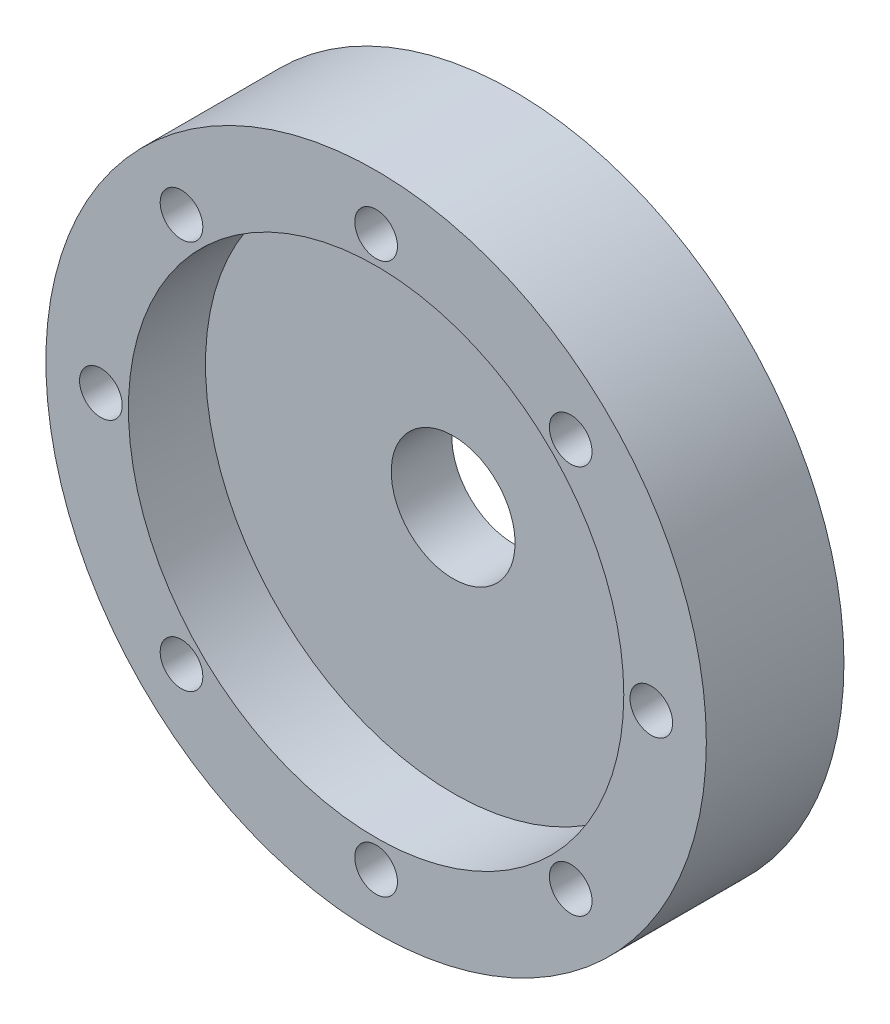
ISO-10303-21;
HEADER;
FILE_DESCRIPTION(('STEP AP214'),'2;1');
FILE_NAME('part.step','',(''),(''),'','','');
FILE_SCHEMA(('AUTOMOTIVE_DESIGN { 1 0 10303 214 1 1 1 1 }'));
ENDSEC;
DATA;
#1=APPLICATION_CONTEXT('core data for automotive mechanical design processes');
#2=APPLICATION_PROTOCOL_DEFINITION('international standard','automotive_design',2000,#1);
#3=PRODUCT_CONTEXT('',#1,'mechanical');
#4=PRODUCT('Part','Part','',(#3));
#5=PRODUCT_RELATED_PRODUCT_CATEGORY('part','',(#4));
#6=PRODUCT_DEFINITION_FORMATION('','',#4);
#7=PRODUCT_DEFINITION_CONTEXT('part definition',#1,'design');
#8=PRODUCT_DEFINITION('design','',#6,#7);
#9=PRODUCT_DEFINITION_SHAPE('','',#8);
#10=(LENGTH_UNIT() NAMED_UNIT(*) SI_UNIT(.MILLI.,.METRE.));
#11=(NAMED_UNIT(*) PLANE_ANGLE_UNIT() SI_UNIT($,.RADIAN.));
#12=(NAMED_UNIT(*) SI_UNIT($,.STERADIAN.) SOLID_ANGLE_UNIT());
#13=UNCERTAINTY_MEASURE_WITH_UNIT(LENGTH_MEASURE(1.E-05),#10,'distance_accuracy_value','');
#14=(GEOMETRIC_REPRESENTATION_CONTEXT(3) GLOBAL_UNCERTAINTY_ASSIGNED_CONTEXT((#13)) GLOBAL_UNIT_ASSIGNED_CONTEXT((#10,
#11,#12)) REPRESENTATION_CONTEXT('',''));
#15=CARTESIAN_POINT('',(0.,0.,0.));
#16=DIRECTION('',(0.,0.,1.));
#17=DIRECTION('',(1.,0.,0.));
#18=AXIS2_PLACEMENT_3D('',#15,#16,#17);
#19=CARTESIAN_POINT('',(0.,0.,10.));
#20=DIRECTION('',(0.,0.,-1.));
#21=DIRECTION('',(-1.,0.,0.));
#22=AXIS2_PLACEMENT_3D('',#19,#20,#21);
#23=CYLINDRICAL_SURFACE('',#22,4.5);
#24=CARTESIAN_POINT('',(0.,0.,0.));
#25=DIRECTION('',(0.,0.,1.));
#26=DIRECTION('',(1.,0.,0.));
#27=AXIS2_PLACEMENT_3D('',#24,#25,#26);
#28=CIRCLE('',#27,4.5);
#29=CARTESIAN_POINT('',(4.5,0.,0.));
#30=VERTEX_POINT('',#29);
#31=EDGE_CURVE('E123',#30,#30,#28,.T.);
#32=ORIENTED_EDGE('',*,*,#31,.F.);
#33=EDGE_LOOP('',(#32));
#34=FACE_BOUND('',#33,.T.);
#35=CARTESIAN_POINT('',(0.,0.,4.4));
#36=DIRECTION('',(0.,0.,1.));
#37=DIRECTION('',(1.,0.,0.));
#38=AXIS2_PLACEMENT_3D('',#35,#36,#37);
#39=CIRCLE('',#38,4.5);
#40=CARTESIAN_POINT('',(4.5,0.,4.4));
#41=VERTEX_POINT('',#40);
#42=EDGE_CURVE('E41',#41,#41,#39,.T.);
#43=ORIENTED_EDGE('',*,*,#42,.T.);
#44=EDGE_LOOP('',(#43));
#45=FACE_BOUND('',#44,.T.);
#46=ADVANCED_FACE('F37',(#34,#45),#23,.F.);
#47=CARTESIAN_POINT('',(0.,20.,10.));
#48=DIRECTION('',(0.,0.,-1.));
#49=DIRECTION('',(-1.,0.,0.));
#50=AXIS2_PLACEMENT_3D('',#47,#48,#49);
#51=CYLINDRICAL_SURFACE('',#50,1.55);
#52=CARTESIAN_POINT('',(0.,20.,10.));
#53=DIRECTION('',(0.,0.,1.));
#54=DIRECTION('',(1.,0.,0.));
#55=AXIS2_PLACEMENT_3D('',#52,#53,#54);
#56=CIRCLE('',#55,1.55);
#57=CARTESIAN_POINT('',(1.55,20.,10.));
#58=VERTEX_POINT('',#57);
#59=EDGE_CURVE('E52',#58,#58,#56,.T.);
#60=ORIENTED_EDGE('',*,*,#59,.T.);
#61=EDGE_LOOP('',(#60));
#62=FACE_BOUND('',#61,.T.);
#63=CARTESIAN_POINT('',(0.,20.,3.));
#64=DIRECTION('',(0.,0.,-1.));
#65=DIRECTION('',(-1.,0.,0.));
#66=AXIS2_PLACEMENT_3D('',#63,#64,#65);
#67=CIRCLE('',#66,1.55);
#68=CARTESIAN_POINT('',(-1.55,20.,3.));
#69=VERTEX_POINT('',#68);
#70=EDGE_CURVE('E85',#69,#69,#67,.T.);
#71=ORIENTED_EDGE('',*,*,#70,.T.);
#72=EDGE_LOOP('',(#71));
#73=FACE_BOUND('',#72,.T.);
#74=ADVANCED_FACE('F132',(#62,#73),#51,.F.);
#75=CARTESIAN_POINT('',(14.1421356237312,14.1421356237316,10.));
#76=DIRECTION('',(0.,0.,-1.));
#77=DIRECTION('',(-1.,0.,0.));
#78=AXIS2_PLACEMENT_3D('',#75,#76,#77);
#79=CYLINDRICAL_SURFACE('',#78,1.5500000000001);
#80=CARTESIAN_POINT('',(14.1421356237312,14.1421356237316,10.));
#81=DIRECTION('',(0.,0.,1.));
#82=DIRECTION('',(1.,0.,0.));
#83=AXIS2_PLACEMENT_3D('',#80,#81,#82);
#84=CIRCLE('',#83,1.5500000000001);
#85=CARTESIAN_POINT('',(15.6921356237313,14.1421356237316,10.));
#86=VERTEX_POINT('',#85);
#87=EDGE_CURVE('E120',#86,#86,#84,.T.);
#88=ORIENTED_EDGE('',*,*,#87,.T.);
#89=EDGE_LOOP('',(#88));
#90=FACE_BOUND('',#89,.T.);
#91=CARTESIAN_POINT('',(14.1421356237312,14.1421356237316,3.));
#92=DIRECTION('',(0.,0.,-1.));
#93=DIRECTION('',(-1.,0.,0.));
#94=AXIS2_PLACEMENT_3D('',#91,#92,#93);
#95=CIRCLE('',#94,1.5500000000001);
#96=CARTESIAN_POINT('',(12.5921356237311,14.1421356237316,3.));
#97=VERTEX_POINT('',#96);
#98=EDGE_CURVE('E82',#97,#97,#95,.T.);
#99=ORIENTED_EDGE('',*,*,#98,.T.);
#100=EDGE_LOOP('',(#99));
#101=FACE_BOUND('',#100,.T.);
#102=ADVANCED_FACE('F266',(#90,#101),#79,.F.);
#103=CARTESIAN_POINT('',(20.0000000000008,8.50201989313825E-13,10.));
#104=DIRECTION('',(0.,0.,-1.));
#105=DIRECTION('',(-1.,0.,0.));
#106=AXIS2_PLACEMENT_3D('',#103,#104,#105);
#107=CYLINDRICAL_SURFACE('',#106,1.55000000000063);
#108=CARTESIAN_POINT('',(20.0000000000008,8.50201989313825E-13,10.));
#109=DIRECTION('',(0.,0.,1.));
#110=DIRECTION('',(1.,0.,0.));
#111=AXIS2_PLACEMENT_3D('',#108,#109,#110);
#112=CIRCLE('',#111,1.55000000000063);
#113=CARTESIAN_POINT('',(21.5500000000015,8.50201989313825E-13,10.));
#114=VERTEX_POINT('',#113);
#115=EDGE_CURVE('E116',#114,#114,#112,.T.);
#116=ORIENTED_EDGE('',*,*,#115,.T.);
#117=EDGE_LOOP('',(#116));
#118=FACE_BOUND('',#117,.T.);
#119=CARTESIAN_POINT('',(20.0000000000008,8.50201989313825E-13,3.));
#120=DIRECTION('',(0.,0.,-1.));
#121=DIRECTION('',(-1.,0.,0.));
#122=AXIS2_PLACEMENT_3D('',#119,#120,#121);
#123=CIRCLE('',#122,1.55000000000063);
#124=CARTESIAN_POINT('',(18.4500000000002,8.50201989313825E-13,3.));
#125=VERTEX_POINT('',#124);
#126=EDGE_CURVE('E78',#125,#125,#123,.T.);
#127=ORIENTED_EDGE('',*,*,#126,.T.);
#128=EDGE_LOOP('',(#127));
#129=FACE_BOUND('',#128,.T.);
#130=ADVANCED_FACE('F272',(#118,#129),#107,.F.);
#131=CARTESIAN_POINT('',(14.1421356237324,-14.1421356237303,10.));
#132=DIRECTION('',(0.,0.,-1.));
#133=DIRECTION('',(-1.,0.,0.));
#134=AXIS2_PLACEMENT_3D('',#131,#132,#133);
#135=CYLINDRICAL_SURFACE('',#134,1.55000000000131);
#136=CARTESIAN_POINT('',(14.1421356237324,-14.1421356237303,10.));
#137=DIRECTION('',(0.,0.,1.));
#138=DIRECTION('',(1.,0.,0.));
#139=AXIS2_PLACEMENT_3D('',#136,#137,#138);
#140=CIRCLE('',#139,1.55000000000131);
#141=CARTESIAN_POINT('',(15.6921356237337,-14.1421356237303,10.));
#142=VERTEX_POINT('',#141);
#143=EDGE_CURVE('E112',#142,#142,#140,.T.);
#144=ORIENTED_EDGE('',*,*,#143,.T.);
#145=EDGE_LOOP('',(#144));
#146=FACE_BOUND('',#145,.T.);
#147=CARTESIAN_POINT('',(14.1421356237324,-14.1421356237303,3.));
#148=DIRECTION('',(0.,0.,-1.));
#149=DIRECTION('',(-1.,0.,0.));
#150=AXIS2_PLACEMENT_3D('',#147,#148,#149);
#151=CIRCLE('',#150,1.55000000000131);
#152=CARTESIAN_POINT('',(12.5921356237311,-14.1421356237303,3.));
#153=VERTEX_POINT('',#152);
#154=EDGE_CURVE('E74',#153,#153,#151,.T.);
#155=ORIENTED_EDGE('',*,*,#154,.T.);
#156=EDGE_LOOP('',(#155));
#157=FACE_BOUND('',#156,.T.);
#158=ADVANCED_FACE('F276',(#146,#157),#135,.F.);
#159=CARTESIAN_POINT('',(1.70040397862765E-12,-20.,10.));
#160=DIRECTION('',(0.,0.,-1.));
#161=DIRECTION('',(-1.,0.,0.));
#162=AXIS2_PLACEMENT_3D('',#159,#160,#161);
#163=CYLINDRICAL_SURFACE('',#162,1.55000000000176);
#164=CARTESIAN_POINT('',(1.70040397862765E-12,-20.,10.));
#165=DIRECTION('',(0.,0.,1.));
#166=DIRECTION('',(1.,0.,0.));
#167=AXIS2_PLACEMENT_3D('',#164,#165,#166);
#168=CIRCLE('',#167,1.55000000000176);
#169=CARTESIAN_POINT('',(1.55000000000346,-20.,10.));
#170=VERTEX_POINT('',#169);
#171=EDGE_CURVE('E108',#170,#170,#168,.T.);
#172=ORIENTED_EDGE('',*,*,#171,.T.);
#173=EDGE_LOOP('',(#172));
#174=FACE_BOUND('',#173,.T.);
#175=CARTESIAN_POINT('',(1.70040397862765E-12,-20.,3.));
#176=DIRECTION('',(0.,0.,-1.));
#177=DIRECTION('',(-1.,0.,0.));
#178=AXIS2_PLACEMENT_3D('',#175,#176,#177);
#179=CIRCLE('',#178,1.55000000000176);
#180=CARTESIAN_POINT('',(-1.55000000000006,-20.,3.));
#181=VERTEX_POINT('',#180);
#182=EDGE_CURVE('E70',#181,#181,#179,.T.);
#183=ORIENTED_EDGE('',*,*,#182,.T.);
#184=EDGE_LOOP('',(#183));
#185=FACE_BOUND('',#184,.T.);
#186=ADVANCED_FACE('F152',(#174,#185),#163,.F.);
#187=CARTESIAN_POINT('',(-14.1421356237295,-14.1421356237316,10.));
#188=DIRECTION('',(0.,0.,-1.));
#189=DIRECTION('',(-1.,0.,0.));
#190=AXIS2_PLACEMENT_3D('',#187,#188,#189);
#191=CYLINDRICAL_SURFACE('',#190,1.55000000000173);
#192=CARTESIAN_POINT('',(-14.1421356237295,-14.1421356237316,10.));
#193=DIRECTION('',(0.,0.,1.));
#194=DIRECTION('',(1.,0.,0.));
#195=AXIS2_PLACEMENT_3D('',#192,#193,#194);
#196=CIRCLE('',#195,1.55000000000173);
#197=CARTESIAN_POINT('',(-12.5921356237278,-14.1421356237316,10.));
#198=VERTEX_POINT('',#197);
#199=EDGE_CURVE('E99',#198,#198,#196,.T.);
#200=ORIENTED_EDGE('',*,*,#199,.T.);
#201=EDGE_LOOP('',(#200));
#202=FACE_BOUND('',#201,.T.);
#203=CARTESIAN_POINT('',(-14.1421356237295,-14.1421356237316,3.));
#204=DIRECTION('',(0.,0.,-1.));
#205=DIRECTION('',(-1.,0.,0.));
#206=AXIS2_PLACEMENT_3D('',#203,#204,#205);
#207=CIRCLE('',#206,1.55000000000173);
#208=CARTESIAN_POINT('',(-15.6921356237312,-14.1421356237316,3.));
#209=VERTEX_POINT('',#208);
#210=EDGE_CURVE('E66',#209,#209,#207,.T.);
#211=ORIENTED_EDGE('',*,*,#210,.T.);
#212=EDGE_LOOP('',(#211));
#213=FACE_BOUND('',#212,.T.);
#214=ADVANCED_FACE('F148',(#202,#213),#191,.F.);
#215=CARTESIAN_POINT('',(-19.9999999999992,-8.5265128291212E-13,10.));
#216=DIRECTION('',(0.,0.,-1.));
#217=DIRECTION('',(-1.,0.,0.));
#218=AXIS2_PLACEMENT_3D('',#215,#216,#217);
#219=CYLINDRICAL_SURFACE('',#218,1.55000000000126);
#220=CARTESIAN_POINT('',(-19.9999999999992,-8.5265128291212E-13,10.));
#221=DIRECTION('',(0.,0.,1.));
#222=DIRECTION('',(1.,0.,0.));
#223=AXIS2_PLACEMENT_3D('',#220,#221,#222);
#224=CIRCLE('',#223,1.55000000000126);
#225=CARTESIAN_POINT('',(-18.4499999999979,-8.5265128291212E-13,10.));
#226=VERTEX_POINT('',#225);
#227=EDGE_CURVE('E93',#226,#226,#224,.T.);
#228=ORIENTED_EDGE('',*,*,#227,.T.);
#229=EDGE_LOOP('',(#228));
#230=FACE_BOUND('',#229,.T.);
#231=CARTESIAN_POINT('',(-19.9999999999992,-8.5265128291212E-13,3.));
#232=DIRECTION('',(0.,0.,-1.));
#233=DIRECTION('',(-1.,0.,0.));
#234=AXIS2_PLACEMENT_3D('',#231,#232,#233);
#235=CIRCLE('',#234,1.55000000000126);
#236=CARTESIAN_POINT('',(-21.5500000000004,-8.5265128291212E-13,3.));
#237=VERTEX_POINT('',#236);
#238=EDGE_CURVE('E61',#237,#237,#235,.T.);
#239=ORIENTED_EDGE('',*,*,#238,.T.);
#240=EDGE_LOOP('',(#239));
#241=FACE_BOUND('',#240,.T.);
#242=ADVANCED_FACE('F151',(#230,#241),#219,.F.);
#243=CARTESIAN_POINT('',(-14.1421356237307,14.1421356237303,10.));
#244=DIRECTION('',(0.,0.,-1.));
#245=DIRECTION('',(-1.,0.,0.));
#246=AXIS2_PLACEMENT_3D('',#243,#244,#245);
#247=CYLINDRICAL_SURFACE('',#246,1.55000000000065);
#248=CARTESIAN_POINT('',(-14.1421356237307,14.1421356237303,10.));
#249=DIRECTION('',(0.,0.,1.));
#250=DIRECTION('',(1.,0.,0.));
#251=AXIS2_PLACEMENT_3D('',#248,#249,#250);
#252=CIRCLE('',#251,1.55000000000065);
#253=CARTESIAN_POINT('',(-12.5921356237301,14.1421356237303,10.));
#254=VERTEX_POINT('',#253);
#255=EDGE_CURVE('E88',#254,#254,#252,.T.);
#256=ORIENTED_EDGE('',*,*,#255,.T.);
#257=EDGE_LOOP('',(#256));
#258=FACE_BOUND('',#257,.T.);
#259=CARTESIAN_POINT('',(-14.1421356237307,14.1421356237303,3.));
#260=DIRECTION('',(0.,0.,-1.));
#261=DIRECTION('',(-1.,0.,0.));
#262=AXIS2_PLACEMENT_3D('',#259,#260,#261);
#263=CIRCLE('',#262,1.55000000000065);
#264=CARTESIAN_POINT('',(-15.6921356237314,14.1421356237303,3.));
#265=VERTEX_POINT('',#264);
#266=EDGE_CURVE('E57',#265,#265,#263,.T.);
#267=ORIENTED_EDGE('',*,*,#266,.T.);
#268=EDGE_LOOP('',(#267));
#269=FACE_BOUND('',#268,.T.);
#270=ADVANCED_FACE('F138',(#258,#269),#247,.F.);
#271=CARTESIAN_POINT('',(0.,0.,10.));
#272=DIRECTION('',(0.,0.,1.));
#273=DIRECTION('',(1.,0.,0.));
#274=AXIS2_PLACEMENT_3D('',#271,#272,#273);
#275=PLANE('',#274);
#276=CARTESIAN_POINT('',(0.,0.,10.));
#277=DIRECTION('',(0.,0.,1.));
#278=DIRECTION('',(1.,0.,0.));
#279=AXIS2_PLACEMENT_3D('',#276,#277,#278);
#280=CIRCLE('',#279,18.);
#281=CARTESIAN_POINT('',(18.,0.,10.));
#282=VERTEX_POINT('',#281);
#283=EDGE_CURVE('E229',#282,#282,#280,.T.);
#284=ORIENTED_EDGE('',*,*,#283,.F.);
#285=EDGE_LOOP('',(#284));
#286=FACE_BOUND('',#285,.T.);
#287=ORIENTED_EDGE('',*,*,#227,.F.);
#288=EDGE_LOOP('',(#287));
#289=FACE_BOUND('',#288,.T.);
#290=ORIENTED_EDGE('',*,*,#171,.F.);
#291=EDGE_LOOP('',(#290));
#292=FACE_BOUND('',#291,.T.);
#293=ORIENTED_EDGE('',*,*,#115,.F.);
#294=EDGE_LOOP('',(#293));
#295=FACE_BOUND('',#294,.T.);
#296=CARTESIAN_POINT('',(0.,0.,10.));
#297=DIRECTION('',(0.,0.,1.));
#298=DIRECTION('',(1.,0.,0.));
#299=AXIS2_PLACEMENT_3D('',#296,#297,#298);
#300=CIRCLE('',#299,24.);
#301=CARTESIAN_POINT('',(24.,0.,10.));
#302=VERTEX_POINT('',#301);
#303=EDGE_CURVE('E10',#302,#302,#300,.T.);
#304=ORIENTED_EDGE('',*,*,#303,.T.);
#305=EDGE_LOOP('',(#304));
#306=FACE_BOUND('',#305,.T.);
#307=ORIENTED_EDGE('',*,*,#59,.F.);
#308=EDGE_LOOP('',(#307));
#309=FACE_BOUND('',#308,.T.);
#310=ORIENTED_EDGE('',*,*,#87,.F.);
#311=EDGE_LOOP('',(#310));
#312=FACE_BOUND('',#311,.T.);
#313=ORIENTED_EDGE('',*,*,#143,.F.);
#314=EDGE_LOOP('',(#313));
#315=FACE_BOUND('',#314,.T.);
#316=ORIENTED_EDGE('',*,*,#199,.F.);
#317=EDGE_LOOP('',(#316));
#318=FACE_BOUND('',#317,.T.);
#319=ORIENTED_EDGE('',*,*,#255,.F.);
#320=EDGE_LOOP('',(#319));
#321=FACE_BOUND('',#320,.T.);
#322=ADVANCED_FACE('F134',(#286,#289,#292,#295,#306,#309,#312,#315,#318,#321),#275,.T.);
#323=CARTESIAN_POINT('',(0.,0.,0.));
#324=DIRECTION('',(0.,0.,1.));
#325=DIRECTION('',(1.,0.,0.));
#326=AXIS2_PLACEMENT_3D('',#323,#324,#325);
#327=PLANE('',#326);
#328=CARTESIAN_POINT('',(14.1421356237307,14.1421356237303,0.));
#329=DIRECTION('',(0.,0.,-1.));
#330=DIRECTION('',(-1.,0.,0.));
#331=AXIS2_PLACEMENT_3D('',#328,#329,#330);
#332=CIRCLE('',#331,3.5);
#333=CARTESIAN_POINT('',(10.6421356237307,14.1421356237303,0.));
#334=VERTEX_POINT('',#333);
#335=EDGE_CURVE('E207',#334,#334,#332,.T.);
#336=ORIENTED_EDGE('',*,*,#335,.F.);
#337=EDGE_LOOP('',(#336));
#338=FACE_BOUND('',#337,.T.);
#339=CARTESIAN_POINT('',(19.9999999999992,-8.5265128291212E-13,0.));
#340=DIRECTION('',(0.,0.,-1.));
#341=DIRECTION('',(-1.,0.,0.));
#342=AXIS2_PLACEMENT_3D('',#339,#340,#341);
#343=CIRCLE('',#342,3.5);
#344=CARTESIAN_POINT('',(16.4999999999992,-8.5265128291212E-13,0.));
#345=VERTEX_POINT('',#344);
#346=EDGE_CURVE('E199',#345,#345,#343,.T.);
#347=ORIENTED_EDGE('',*,*,#346,.F.);
#348=EDGE_LOOP('',(#347));
#349=FACE_BOUND('',#348,.T.);
#350=CARTESIAN_POINT('',(14.1421356237295,-14.1421356237316,0.));
#351=DIRECTION('',(0.,0.,-1.));
#352=DIRECTION('',(-1.,0.,0.));
#353=AXIS2_PLACEMENT_3D('',#350,#351,#352);
#354=CIRCLE('',#353,3.5);
#355=CARTESIAN_POINT('',(10.6421356237295,-14.1421356237316,0.));
#356=VERTEX_POINT('',#355);
#357=EDGE_CURVE('E191',#356,#356,#354,.T.);
#358=ORIENTED_EDGE('',*,*,#357,.F.);
#359=EDGE_LOOP('',(#358));
#360=FACE_BOUND('',#359,.T.);
#361=CARTESIAN_POINT('',(-1.70040397862765E-12,-20.,0.));
#362=DIRECTION('',(0.,0.,-1.));
#363=DIRECTION('',(-1.,0.,0.));
#364=AXIS2_PLACEMENT_3D('',#361,#362,#363);
#365=CIRCLE('',#364,3.5);
#366=CARTESIAN_POINT('',(-3.5000000000017,-20.,0.));
#367=VERTEX_POINT('',#366);
#368=EDGE_CURVE('E183',#367,#367,#365,.T.);
#369=ORIENTED_EDGE('',*,*,#368,.F.);
#370=EDGE_LOOP('',(#369));
#371=FACE_BOUND('',#370,.T.);
#372=CARTESIAN_POINT('',(-14.1421356237324,-14.1421356237303,0.));
#373=DIRECTION('',(0.,0.,-1.));
#374=DIRECTION('',(-1.,0.,0.));
#375=AXIS2_PLACEMENT_3D('',#372,#373,#374);
#376=CIRCLE('',#375,3.5);
#377=CARTESIAN_POINT('',(-17.6421356237324,-14.1421356237303,0.));
#378=VERTEX_POINT('',#377);
#379=EDGE_CURVE('E168',#378,#378,#376,.T.);
#380=ORIENTED_EDGE('',*,*,#379,.F.);
#381=EDGE_LOOP('',(#380));
#382=FACE_BOUND('',#381,.T.);
#383=CARTESIAN_POINT('',(-20.0000000000008,8.50201989313825E-13,0.));
#384=DIRECTION('',(0.,0.,-1.));
#385=DIRECTION('',(-1.,0.,0.));
#386=AXIS2_PLACEMENT_3D('',#383,#384,#385);
#387=CIRCLE('',#386,3.5);
#388=CARTESIAN_POINT('',(-23.5000000000008,8.50201989313825E-13,0.));
#389=VERTEX_POINT('',#388);
#390=EDGE_CURVE('E167',#389,#389,#387,.T.);
#391=ORIENTED_EDGE('',*,*,#390,.F.);
#392=EDGE_LOOP('',(#391));
#393=FACE_BOUND('',#392,.T.);
#394=CARTESIAN_POINT('',(-14.1421356237312,14.1421356237316,0.));
#395=DIRECTION('',(0.,0.,-1.));
#396=DIRECTION('',(-1.,0.,0.));
#397=AXIS2_PLACEMENT_3D('',#394,#395,#396);
#398=CIRCLE('',#397,3.5);
#399=CARTESIAN_POINT('',(-17.6421356237312,14.1421356237316,0.));
#400=VERTEX_POINT('',#399);
#401=EDGE_CURVE('E221',#400,#400,#398,.T.);
#402=ORIENTED_EDGE('',*,*,#401,.F.);
#403=EDGE_LOOP('',(#402));
#404=FACE_BOUND('',#403,.T.);
#405=CARTESIAN_POINT('',(0.,20.,0.));
#406=DIRECTION('',(0.,0.,-1.));
#407=DIRECTION('',(-1.,0.,0.));
#408=AXIS2_PLACEMENT_3D('',#405,#406,#407);
#409=CIRCLE('',#408,3.5);
#410=CARTESIAN_POINT('',(-3.5,20.,0.));
#411=VERTEX_POINT('',#410);
#412=EDGE_CURVE('E102',#411,#411,#409,.T.);
#413=ORIENTED_EDGE('',*,*,#412,.F.);
#414=EDGE_LOOP('',(#413));
#415=FACE_BOUND('',#414,.T.);
#416=CARTESIAN_POINT('',(0.,0.,0.));
#417=DIRECTION('',(0.,0.,1.));
#418=DIRECTION('',(1.,0.,0.));
#419=AXIS2_PLACEMENT_3D('',#416,#417,#418);
#420=CIRCLE('',#419,24.);
#421=CARTESIAN_POINT('',(24.,0.,0.));
#422=VERTEX_POINT('',#421);
#423=EDGE_CURVE('E46',#422,#422,#420,.T.);
#424=ORIENTED_EDGE('',*,*,#423,.F.);
#425=EDGE_LOOP('',(#424));
#426=FACE_BOUND('',#425,.T.);
#427=ORIENTED_EDGE('',*,*,#31,.T.);
#428=EDGE_LOOP('',(#427));
#429=FACE_BOUND('',#428,.T.);
#430=ADVANCED_FACE('F137',(#338,#349,#360,#371,#382,#393,#404,#415,#426,#429),#327,.F.);
#431=CARTESIAN_POINT('',(0.,0.,10.));
#432=DIRECTION('',(0.,0.,-1.));
#433=DIRECTION('',(-1.,0.,0.));
#434=AXIS2_PLACEMENT_3D('',#431,#432,#433);
#435=CYLINDRICAL_SURFACE('',#434,24.);
#436=ORIENTED_EDGE('',*,*,#303,.F.);
#437=EDGE_LOOP('',(#436));
#438=FACE_BOUND('',#437,.T.);
#439=ORIENTED_EDGE('',*,*,#423,.T.);
#440=EDGE_LOOP('',(#439));
#441=FACE_BOUND('',#440,.T.);
#442=ADVANCED_FACE('F39',(#438,#441),#435,.T.);
#443=CARTESIAN_POINT('',(-14.1421356237312,14.1421356237316,3.));
#444=DIRECTION('',(0.,0.,-1.));
#445=DIRECTION('',(-1.,0.,0.));
#446=AXIS2_PLACEMENT_3D('',#443,#444,#445);
#447=CYLINDRICAL_SURFACE('',#446,3.5);
#448=CARTESIAN_POINT('',(-14.1421356237312,14.1421356237316,3.));
#449=DIRECTION('',(0.,0.,-1.));
#450=DIRECTION('',(-1.,0.,0.));
#451=AXIS2_PLACEMENT_3D('',#448,#449,#450);
#452=CIRCLE('',#451,3.5);
#453=CARTESIAN_POINT('',(-17.6421356237312,14.1421356237316,3.));
#454=VERTEX_POINT('',#453);
#455=EDGE_CURVE('E216',#454,#454,#452,.T.);
#456=ORIENTED_EDGE('',*,*,#455,.F.);
#457=EDGE_LOOP('',(#456));
#458=FACE_BOUND('',#457,.T.);
#459=ORIENTED_EDGE('',*,*,#401,.T.);
#460=EDGE_LOOP('',(#459));
#461=FACE_BOUND('',#460,.T.);
#462=ADVANCED_FACE('F253',(#458,#461),#447,.F.);
#463=CARTESIAN_POINT('',(-14.1421356237312,14.1421356237316,3.));
#464=DIRECTION('',(0.,0.,-1.));
#465=DIRECTION('',(-1.,0.,0.));
#466=AXIS2_PLACEMENT_3D('',#463,#464,#465);
#467=PLANE('',#466);
#468=ORIENTED_EDGE('',*,*,#266,.F.);
#469=EDGE_LOOP('',(#468));
#470=FACE_BOUND('',#469,.T.);
#471=ORIENTED_EDGE('',*,*,#455,.T.);
#472=EDGE_LOOP('',(#471));
#473=FACE_BOUND('',#472,.T.);
#474=ADVANCED_FACE('F240',(#470,#473),#467,.T.);
#475=CARTESIAN_POINT('',(-20.0000000000008,8.50201989313825E-13,3.));
#476=DIRECTION('',(0.,0.,-1.));
#477=DIRECTION('',(-1.,0.,0.));
#478=AXIS2_PLACEMENT_3D('',#475,#476,#477);
#479=CYLINDRICAL_SURFACE('',#478,3.5);
#480=CARTESIAN_POINT('',(-20.0000000000008,8.50201989313825E-13,3.));
#481=DIRECTION('',(0.,0.,-1.));
#482=DIRECTION('',(-1.,0.,0.));
#483=AXIS2_PLACEMENT_3D('',#480,#481,#482);
#484=CIRCLE('',#483,3.5);
#485=CARTESIAN_POINT('',(-23.5000000000008,8.50201989313825E-13,3.));
#486=VERTEX_POINT('',#485);
#487=EDGE_CURVE('E173',#486,#486,#484,.T.);
#488=ORIENTED_EDGE('',*,*,#487,.F.);
#489=EDGE_LOOP('',(#488));
#490=FACE_BOUND('',#489,.T.);
#491=ORIENTED_EDGE('',*,*,#390,.T.);
#492=EDGE_LOOP('',(#491));
#493=FACE_BOUND('',#492,.T.);
#494=ADVANCED_FACE('F237',(#490,#493),#479,.F.);
#495=CARTESIAN_POINT('',(-20.0000000000008,8.50201989313825E-13,3.));
#496=DIRECTION('',(0.,0.,-1.));
#497=DIRECTION('',(-1.,0.,0.));
#498=AXIS2_PLACEMENT_3D('',#495,#496,#497);
#499=PLANE('',#498);
#500=ORIENTED_EDGE('',*,*,#238,.F.);
#501=EDGE_LOOP('',(#500));
#502=FACE_BOUND('',#501,.T.);
#503=ORIENTED_EDGE('',*,*,#487,.T.);
#504=EDGE_LOOP('',(#503));
#505=FACE_BOUND('',#504,.T.);
#506=ADVANCED_FACE('F235',(#502,#505),#499,.T.);
#507=CARTESIAN_POINT('',(-14.1421356237324,-14.1421356237303,3.));
#508=DIRECTION('',(0.,0.,-1.));
#509=DIRECTION('',(-1.,0.,0.));
#510=AXIS2_PLACEMENT_3D('',#507,#508,#509);
#511=CYLINDRICAL_SURFACE('',#510,3.5);
#512=CARTESIAN_POINT('',(-14.1421356237324,-14.1421356237303,3.));
#513=DIRECTION('',(0.,0.,-1.));
#514=DIRECTION('',(-1.,0.,0.));
#515=AXIS2_PLACEMENT_3D('',#512,#513,#514);
#516=CIRCLE('',#515,3.5);
#517=CARTESIAN_POINT('',(-17.6421356237324,-14.1421356237303,3.));
#518=VERTEX_POINT('',#517);
#519=EDGE_CURVE('E164',#518,#518,#516,.T.);
#520=ORIENTED_EDGE('',*,*,#519,.F.);
#521=EDGE_LOOP('',(#520));
#522=FACE_BOUND('',#521,.T.);
#523=ORIENTED_EDGE('',*,*,#379,.T.);
#524=EDGE_LOOP('',(#523));
#525=FACE_BOUND('',#524,.T.);
#526=ADVANCED_FACE('F160',(#522,#525),#511,.F.);
#527=CARTESIAN_POINT('',(-14.1421356237324,-14.1421356237303,3.));
#528=DIRECTION('',(0.,0.,-1.));
#529=DIRECTION('',(-1.,0.,0.));
#530=AXIS2_PLACEMENT_3D('',#527,#528,#529);
#531=PLANE('',#530);
#532=ORIENTED_EDGE('',*,*,#210,.F.);
#533=EDGE_LOOP('',(#532));
#534=FACE_BOUND('',#533,.T.);
#535=ORIENTED_EDGE('',*,*,#519,.T.);
#536=EDGE_LOOP('',(#535));
#537=FACE_BOUND('',#536,.T.);
#538=ADVANCED_FACE('F156',(#534,#537),#531,.T.);
#539=CARTESIAN_POINT('',(-1.70040397862765E-12,-20.,3.));
#540=DIRECTION('',(0.,0.,-1.));
#541=DIRECTION('',(-1.,0.,0.));
#542=AXIS2_PLACEMENT_3D('',#539,#540,#541);
#543=CYLINDRICAL_SURFACE('',#542,3.5);
#544=CARTESIAN_POINT('',(-1.70040397862765E-12,-20.,3.));
#545=DIRECTION('',(0.,0.,-1.));
#546=DIRECTION('',(-1.,0.,0.));
#547=AXIS2_PLACEMENT_3D('',#544,#545,#546);
#548=CIRCLE('',#547,3.5);
#549=CARTESIAN_POINT('',(-3.5000000000017,-20.,3.));
#550=VERTEX_POINT('',#549);
#551=EDGE_CURVE('E176',#550,#550,#548,.T.);
#552=ORIENTED_EDGE('',*,*,#551,.F.);
#553=EDGE_LOOP('',(#552));
#554=FACE_BOUND('',#553,.T.);
#555=ORIENTED_EDGE('',*,*,#368,.T.);
#556=EDGE_LOOP('',(#555));
#557=FACE_BOUND('',#556,.T.);
#558=ADVANCED_FACE('F159',(#554,#557),#543,.F.);
#559=CARTESIAN_POINT('',(-1.70040397862765E-12,-20.,3.));
#560=DIRECTION('',(0.,0.,-1.));
#561=DIRECTION('',(-1.,0.,0.));
#562=AXIS2_PLACEMENT_3D('',#559,#560,#561);
#563=PLANE('',#562);
#564=ORIENTED_EDGE('',*,*,#182,.F.);
#565=EDGE_LOOP('',(#564));
#566=FACE_BOUND('',#565,.T.);
#567=ORIENTED_EDGE('',*,*,#551,.T.);
#568=EDGE_LOOP('',(#567));
#569=FACE_BOUND('',#568,.T.);
#570=ADVANCED_FACE('F318',(#566,#569),#563,.T.);
#571=CARTESIAN_POINT('',(14.1421356237295,-14.1421356237316,3.));
#572=DIRECTION('',(0.,0.,-1.));
#573=DIRECTION('',(-1.,0.,0.));
#574=AXIS2_PLACEMENT_3D('',#571,#572,#573);
#575=CYLINDRICAL_SURFACE('',#574,3.5);
#576=CARTESIAN_POINT('',(14.1421356237295,-14.1421356237316,3.));
#577=DIRECTION('',(0.,0.,-1.));
#578=DIRECTION('',(-1.,0.,0.));
#579=AXIS2_PLACEMENT_3D('',#576,#577,#578);
#580=CIRCLE('',#579,3.5);
#581=CARTESIAN_POINT('',(10.6421356237295,-14.1421356237316,3.));
#582=VERTEX_POINT('',#581);
#583=EDGE_CURVE('E187',#582,#582,#580,.T.);
#584=ORIENTED_EDGE('',*,*,#583,.F.);
#585=EDGE_LOOP('',(#584));
#586=FACE_BOUND('',#585,.T.);
#587=ORIENTED_EDGE('',*,*,#357,.T.);
#588=EDGE_LOOP('',(#587));
#589=FACE_BOUND('',#588,.T.);
#590=ADVANCED_FACE('F315',(#586,#589),#575,.F.);
#591=CARTESIAN_POINT('',(14.1421356237295,-14.1421356237316,3.));
#592=DIRECTION('',(0.,0.,-1.));
#593=DIRECTION('',(-1.,0.,0.));
#594=AXIS2_PLACEMENT_3D('',#591,#592,#593);
#595=PLANE('',#594);
#596=ORIENTED_EDGE('',*,*,#154,.F.);
#597=EDGE_LOOP('',(#596));
#598=FACE_BOUND('',#597,.T.);
#599=ORIENTED_EDGE('',*,*,#583,.T.);
#600=EDGE_LOOP('',(#599));
#601=FACE_BOUND('',#600,.T.);
#602=ADVANCED_FACE('F310',(#598,#601),#595,.T.);
#603=CARTESIAN_POINT('',(19.9999999999992,-8.5265128291212E-13,3.));
#604=DIRECTION('',(0.,0.,-1.));
#605=DIRECTION('',(-1.,0.,0.));
#606=AXIS2_PLACEMENT_3D('',#603,#604,#605);
#607=CYLINDRICAL_SURFACE('',#606,3.5);
#608=CARTESIAN_POINT('',(19.9999999999992,-8.5265128291212E-13,3.));
#609=DIRECTION('',(0.,0.,-1.));
#610=DIRECTION('',(-1.,0.,0.));
#611=AXIS2_PLACEMENT_3D('',#608,#609,#610);
#612=CIRCLE('',#611,3.5);
#613=CARTESIAN_POINT('',(16.4999999999992,-8.5265128291212E-13,3.));
#614=VERTEX_POINT('',#613);
#615=EDGE_CURVE('E195',#614,#614,#612,.T.);
#616=ORIENTED_EDGE('',*,*,#615,.F.);
#617=EDGE_LOOP('',(#616));
#618=FACE_BOUND('',#617,.T.);
#619=ORIENTED_EDGE('',*,*,#346,.T.);
#620=EDGE_LOOP('',(#619));
#621=FACE_BOUND('',#620,.T.);
#622=ADVANCED_FACE('F307',(#618,#621),#607,.F.);
#623=CARTESIAN_POINT('',(19.9999999999992,-8.5265128291212E-13,3.));
#624=DIRECTION('',(0.,0.,-1.));
#625=DIRECTION('',(-1.,0.,0.));
#626=AXIS2_PLACEMENT_3D('',#623,#624,#625);
#627=PLANE('',#626);
#628=ORIENTED_EDGE('',*,*,#126,.F.);
#629=EDGE_LOOP('',(#628));
#630=FACE_BOUND('',#629,.T.);
#631=ORIENTED_EDGE('',*,*,#615,.T.);
#632=EDGE_LOOP('',(#631));
#633=FACE_BOUND('',#632,.T.);
#634=ADVANCED_FACE('F302',(#630,#633),#627,.T.);
#635=CARTESIAN_POINT('',(14.1421356237307,14.1421356237303,3.));
#636=DIRECTION('',(0.,0.,-1.));
#637=DIRECTION('',(-1.,0.,0.));
#638=AXIS2_PLACEMENT_3D('',#635,#636,#637);
#639=CYLINDRICAL_SURFACE('',#638,3.5);
#640=CARTESIAN_POINT('',(14.1421356237307,14.1421356237303,3.));
#641=DIRECTION('',(0.,0.,-1.));
#642=DIRECTION('',(-1.,0.,0.));
#643=AXIS2_PLACEMENT_3D('',#640,#641,#642);
#644=CIRCLE('',#643,3.5);
#645=CARTESIAN_POINT('',(10.6421356237307,14.1421356237303,3.));
#646=VERTEX_POINT('',#645);
#647=EDGE_CURVE('E203',#646,#646,#644,.T.);
#648=ORIENTED_EDGE('',*,*,#647,.F.);
#649=EDGE_LOOP('',(#648));
#650=FACE_BOUND('',#649,.T.);
#651=ORIENTED_EDGE('',*,*,#335,.T.);
#652=EDGE_LOOP('',(#651));
#653=FACE_BOUND('',#652,.T.);
#654=ADVANCED_FACE('F299',(#650,#653),#639,.F.);
#655=CARTESIAN_POINT('',(14.1421356237307,14.1421356237303,3.));
#656=DIRECTION('',(0.,0.,-1.));
#657=DIRECTION('',(-1.,0.,0.));
#658=AXIS2_PLACEMENT_3D('',#655,#656,#657);
#659=PLANE('',#658);
#660=ORIENTED_EDGE('',*,*,#98,.F.);
#661=EDGE_LOOP('',(#660));
#662=FACE_BOUND('',#661,.T.);
#663=ORIENTED_EDGE('',*,*,#647,.T.);
#664=EDGE_LOOP('',(#663));
#665=FACE_BOUND('',#664,.T.);
#666=ADVANCED_FACE('F293',(#662,#665),#659,.T.);
#667=CARTESIAN_POINT('',(0.,20.,3.));
#668=DIRECTION('',(0.,0.,-1.));
#669=DIRECTION('',(-1.,0.,0.));
#670=AXIS2_PLACEMENT_3D('',#667,#668,#669);
#671=CYLINDRICAL_SURFACE('',#670,3.5);
#672=CARTESIAN_POINT('',(0.,20.,3.));
#673=DIRECTION('',(0.,0.,-1.));
#674=DIRECTION('',(-1.,0.,0.));
#675=AXIS2_PLACEMENT_3D('',#672,#673,#674);
#676=CIRCLE('',#675,3.5);
#677=CARTESIAN_POINT('',(-3.5,20.,3.));
#678=VERTEX_POINT('',#677);
#679=EDGE_CURVE('E62',#678,#678,#676,.T.);
#680=ORIENTED_EDGE('',*,*,#679,.F.);
#681=EDGE_LOOP('',(#680));
#682=FACE_BOUND('',#681,.T.);
#683=ORIENTED_EDGE('',*,*,#412,.T.);
#684=EDGE_LOOP('',(#683));
#685=FACE_BOUND('',#684,.T.);
#686=ADVANCED_FACE('F289',(#682,#685),#671,.F.);
#687=CARTESIAN_POINT('',(0.,20.,3.));
#688=DIRECTION('',(0.,0.,-1.));
#689=DIRECTION('',(-1.,0.,0.));
#690=AXIS2_PLACEMENT_3D('',#687,#688,#689);
#691=PLANE('',#690);
#692=ORIENTED_EDGE('',*,*,#70,.F.);
#693=EDGE_LOOP('',(#692));
#694=FACE_BOUND('',#693,.T.);
#695=ORIENTED_EDGE('',*,*,#679,.T.);
#696=EDGE_LOOP('',(#695));
#697=FACE_BOUND('',#696,.T.);
#698=ADVANCED_FACE('F292',(#694,#697),#691,.T.);
#699=CARTESIAN_POINT('',(0.,0.,4.4));
#700=DIRECTION('',(0.,0.,1.));
#701=DIRECTION('',(1.,0.,0.));
#702=AXIS2_PLACEMENT_3D('',#699,#700,#701);
#703=CYLINDRICAL_SURFACE('',#702,18.);
#704=CARTESIAN_POINT('',(0.,0.,4.4));
#705=DIRECTION('',(0.,0.,1.));
#706=DIRECTION('',(1.,0.,0.));
#707=AXIS2_PLACEMENT_3D('',#704,#705,#706);
#708=CIRCLE('',#707,18.);
#709=CARTESIAN_POINT('',(18.,0.,4.4));
#710=VERTEX_POINT('',#709);
#711=EDGE_CURVE('E350',#710,#710,#708,.T.);
#712=ORIENTED_EDGE('',*,*,#711,.F.);
#713=EDGE_LOOP('',(#712));
#714=FACE_BOUND('',#713,.T.);
#715=ORIENTED_EDGE('',*,*,#283,.T.);
#716=EDGE_LOOP('',(#715));
#717=FACE_BOUND('',#716,.T.);
#718=ADVANCED_FACE('F297',(#714,#717),#703,.F.);
#719=CARTESIAN_POINT('',(0.,0.,4.4));
#720=DIRECTION('',(0.,0.,1.));
#721=DIRECTION('',(1.,0.,0.));
#722=AXIS2_PLACEMENT_3D('',#719,#720,#721);
#723=PLANE('',#722);
#724=ORIENTED_EDGE('',*,*,#42,.F.);
#725=EDGE_LOOP('',(#724));
#726=FACE_BOUND('',#725,.T.);
#727=ORIENTED_EDGE('',*,*,#711,.T.);
#728=EDGE_LOOP('',(#727));
#729=FACE_BOUND('',#728,.T.);
#730=ADVANCED_FACE('F339',(#726,#729),#723,.T.);
#731=CLOSED_SHELL('',(#46,#74,#102,#130,#158,#186,#214,#242,#270,#322,#430,#442,#462,#474,#494,
#506,#526,#538,#558,#570,#590,#602,#622,#634,#654,#666,#686,#698,#718,#730));
#732=MANIFOLD_SOLID_BREP('B2',#731);
#733=ADVANCED_BREP_SHAPE_REPRESENTATION('',(#18,#732),#14);
#734=SHAPE_DEFINITION_REPRESENTATION(#9,#733);
ENDSEC;
END-ISO-10303-21;
